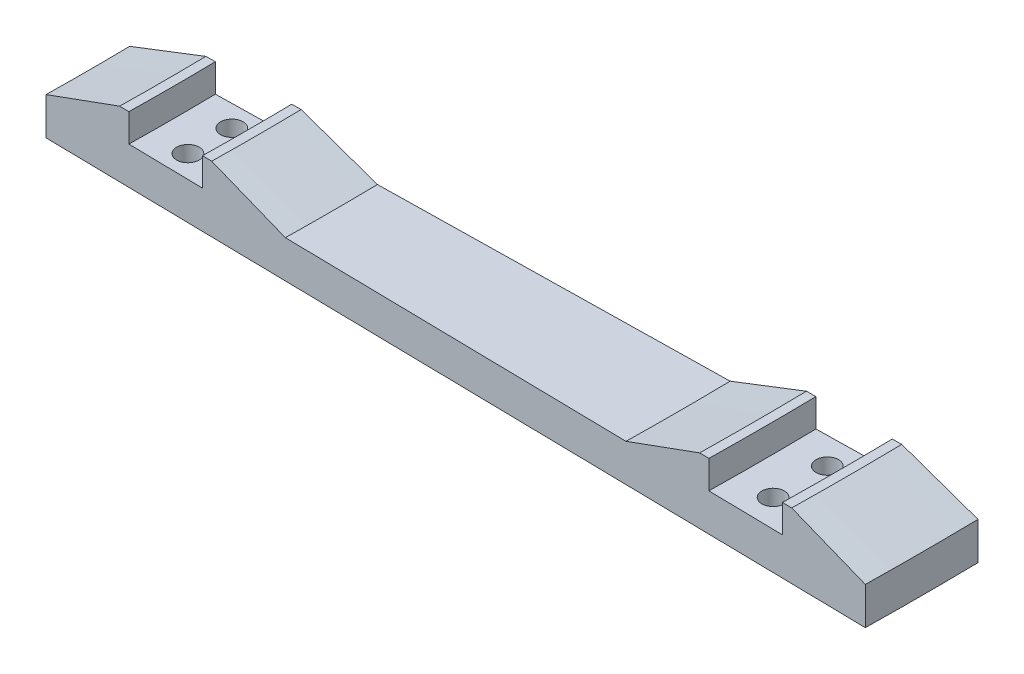
ISO-10303-21;
HEADER;
FILE_DESCRIPTION(('STEP AP214'),'2;1');
FILE_NAME('part.step','',(''),(''),'','','');
FILE_SCHEMA(('AUTOMOTIVE_DESIGN { 1 0 10303 214 1 1 1 1 }'));
ENDSEC;
DATA;
#1=APPLICATION_CONTEXT('core data for automotive mechanical design processes');
#2=APPLICATION_PROTOCOL_DEFINITION('international standard','automotive_design',2000,#1);
#3=PRODUCT_CONTEXT('',#1,'mechanical');
#4=PRODUCT('Part','Part','',(#3));
#5=PRODUCT_RELATED_PRODUCT_CATEGORY('part','',(#4));
#6=PRODUCT_DEFINITION_FORMATION('','',#4);
#7=PRODUCT_DEFINITION_CONTEXT('part definition',#1,'design');
#8=PRODUCT_DEFINITION('design','',#6,#7);
#9=PRODUCT_DEFINITION_SHAPE('','',#8);
#10=(LENGTH_UNIT() NAMED_UNIT(*) SI_UNIT(.MILLI.,.METRE.));
#11=(NAMED_UNIT(*) PLANE_ANGLE_UNIT() SI_UNIT($,.RADIAN.));
#12=(NAMED_UNIT(*) SI_UNIT($,.STERADIAN.) SOLID_ANGLE_UNIT());
#13=UNCERTAINTY_MEASURE_WITH_UNIT(LENGTH_MEASURE(1.E-05),#10,'distance_accuracy_value','');
#14=(GEOMETRIC_REPRESENTATION_CONTEXT(3) GLOBAL_UNCERTAINTY_ASSIGNED_CONTEXT((#13)) GLOBAL_UNIT_ASSIGNED_CONTEXT((#10,
#11,#12)) REPRESENTATION_CONTEXT('',''));
#15=CARTESIAN_POINT('',(0.,0.,0.));
#16=DIRECTION('',(0.,0.,1.));
#17=DIRECTION('',(1.,0.,0.));
#18=AXIS2_PLACEMENT_3D('',#15,#16,#17);
#19=CARTESIAN_POINT('',(33.4936887478864,-3.50000000000021,3.94642325885546));
#20=DIRECTION('',(0.,1.,0.));
#21=DIRECTION('',(-1.,0.,0.));
#22=AXIS2_PLACEMENT_3D('',#19,#20,#21);
#23=CYLINDRICAL_SURFACE('',#22,0.600000000000001);
#24=CARTESIAN_POINT('',(33.4936887478864,-1.50000000000005,3.94642325885546));
#25=DIRECTION('',(0.,1.,0.));
#26=DIRECTION('',(-1.,0.,0.));
#27=AXIS2_PLACEMENT_3D('',#24,#25,#26);
#28=CIRCLE('',#27,0.600000000000001);
#29=CARTESIAN_POINT('',(32.8936887478864,-1.50000000000005,3.94642325885546));
#30=VERTEX_POINT('',#29);
#31=EDGE_CURVE('E255',#30,#30,#28,.T.);
#32=ORIENTED_EDGE('',*,*,#31,.T.);
#33=EDGE_LOOP('',(#32));
#34=FACE_BOUND('',#33,.T.);
#35=CARTESIAN_POINT('',(33.4936887478864,-2.49999999999999,3.94642325885546));
#36=DIRECTION('',(0.,-1.,0.));
#37=DIRECTION('',(1.,0.,0.));
#38=AXIS2_PLACEMENT_3D('',#35,#36,#37);
#39=CIRCLE('',#38,0.600000000000001);
#40=CARTESIAN_POINT('',(34.0936887478864,-2.49999999999999,3.94642325885546));
#41=VERTEX_POINT('',#40);
#42=EDGE_CURVE('E44',#41,#41,#39,.F.);
#43=ORIENTED_EDGE('',*,*,#42,.F.);
#44=EDGE_LOOP('',(#43));
#45=FACE_BOUND('',#44,.T.);
#46=ADVANCED_FACE('F40',(#34,#45),#23,.F.);
#47=CARTESIAN_POINT('',(1.99488817136499,-3.5000000000001,3.67153739065677));
#48=DIRECTION('',(0.,1.,0.));
#49=DIRECTION('',(-1.,0.,0.));
#50=AXIS2_PLACEMENT_3D('',#47,#48,#49);
#51=CYLINDRICAL_SURFACE('',#50,0.6);
#52=CARTESIAN_POINT('',(1.994888171365,-1.49999999999994,3.67153739065677));
#53=DIRECTION('',(0.,1.,0.));
#54=DIRECTION('',(-1.,0.,0.));
#55=AXIS2_PLACEMENT_3D('',#52,#53,#54);
#56=CIRCLE('',#55,0.6);
#57=CARTESIAN_POINT('',(1.394888171365,-1.49999999999994,3.67153739065677));
#58=VERTEX_POINT('',#57);
#59=EDGE_CURVE('E259',#58,#58,#56,.T.);
#60=ORIENTED_EDGE('',*,*,#59,.T.);
#61=EDGE_LOOP('',(#60));
#62=FACE_BOUND('',#61,.T.);
#63=CARTESIAN_POINT('',(1.99488817136499,-2.5,3.67153739065677));
#64=DIRECTION('',(0.,-1.,0.));
#65=DIRECTION('',(1.,0.,0.));
#66=AXIS2_PLACEMENT_3D('',#63,#64,#65);
#67=CIRCLE('',#66,0.6);
#68=CARTESIAN_POINT('',(2.59488817136499,-2.5,3.67153739065677));
#69=VERTEX_POINT('',#68);
#70=EDGE_CURVE('E246',#69,#69,#67,.F.);
#71=ORIENTED_EDGE('',*,*,#70,.F.);
#72=EDGE_LOOP('',(#71));
#73=FACE_BOUND('',#72,.T.);
#74=ADVANCED_FACE('F350',(#62,#73),#51,.F.);
#75=CARTESIAN_POINT('',(0.,0.,2.5));
#76=DIRECTION('',(0.,-1.,0.));
#77=DIRECTION('',(1.,0.,0.));
#78=AXIS2_PLACEMENT_3D('',#75,#76,#77);
#79=PLANE('',#78);
#80=CARTESIAN_POINT('',(-132.25,0.,2.5));
#81=DIRECTION('',(0.,1.,0.));
#82=DIRECTION('',(0.,0.,1.));
#83=AXIS2_PLACEMENT_3D('',#80,#81,#82);
#84=CIRCLE('',#83,132.25);
#85=CARTESIAN_POINT('',(-0.0201423155672546,0.,4.80808075133075));
#86=VERTEX_POINT('',#85);
#87=CARTESIAN_POINT('',(-0.0201423155672546,0.,0.191919248669251));
#88=VERTEX_POINT('',#87);
#89=EDGE_CURVE('E11',#86,#88,#84,.T.);
#90=ORIENTED_EDGE('',*,*,#89,.T.);
#91=DIRECTION('',(-0.999847695156391,0.,0.0174524064372835));
#92=VECTOR('',#91,1.);
#93=CARTESIAN_POINT('',(-0.0201423155672546,0.,0.191919248669251));
#94=LINE('',#93,#92);
#95=CARTESIAN_POINT('',(-0.52006616314545,0.,0.200645451887892));
#96=VERTEX_POINT('',#95);
#97=EDGE_CURVE('E170',#88,#96,#94,.T.);
#98=ORIENTED_EDGE('',*,*,#97,.T.);
#99=CARTESIAN_POINT('',(-132.25,0.,2.5));
#100=DIRECTION('',(0.,1.,0.));
#101=DIRECTION('',(0.,0.,1.));
#102=AXIS2_PLACEMENT_3D('',#99,#100,#101);
#103=CIRCLE('',#102,131.75);
#104=CARTESIAN_POINT('',(-0.52006616314545,0.,4.79935454811211));
#105=VERTEX_POINT('',#104);
#106=EDGE_CURVE('E49',#105,#96,#103,.T.);
#107=ORIENTED_EDGE('',*,*,#106,.F.);
#108=DIRECTION('',(-0.999847695156391,0.,-0.0174524064372835));
#109=VECTOR('',#108,1.);
#110=CARTESIAN_POINT('',(-0.0201423155672546,0.,4.80808075133075));
#111=LINE('',#110,#109);
#112=EDGE_CURVE('E172',#86,#105,#111,.T.);
#113=ORIENTED_EDGE('',*,*,#112,.F.);
#114=EDGE_LOOP('',(#90,#98,#107,#113));
#115=FACE_BOUND('',#114,.T.);
#116=ADVANCED_FACE('F42',(#115),#79,.F.);
#117=CARTESIAN_POINT('',(0.,-3.5,2.5));
#118=DIRECTION('',(0.,-1.,0.));
#119=DIRECTION('',(1.,0.,0.));
#120=AXIS2_PLACEMENT_3D('',#117,#118,#119);
#121=PLANE('',#120);
#122=CARTESIAN_POINT('',(-132.25,-3.5,2.5));
#123=DIRECTION('',(0.,1.,0.));
#124=DIRECTION('',(0.,0.,1.));
#125=AXIS2_PLACEMENT_3D('',#122,#123,#124);
#126=CIRCLE('',#125,127.75);
#127=CARTESIAN_POINT('',(-4.51945694377102,-3.5,4.72954492236297));
#128=VERTEX_POINT('',#127);
#129=CARTESIAN_POINT('',(-4.51945694377102,-3.5,0.270455077637027));
#130=VERTEX_POINT('',#129);
#131=EDGE_CURVE('E337',#128,#130,#126,.T.);
#132=ORIENTED_EDGE('',*,*,#131,.T.);
#133=DIRECTION('',(0.999847695156391,0.,-0.0174524064372835));
#134=VECTOR('',#133,1.);
#135=CARTESIAN_POINT('',(-4.51945694377102,-3.5,0.270455077637027));
#136=LINE('',#135,#134);
#137=CARTESIAN_POINT('',(39.9737654906884,-3.50000000000008,-0.506177008822091));
#138=VERTEX_POINT('',#137);
#139=EDGE_CURVE('E194',#130,#138,#136,.T.);
#140=ORIENTED_EDGE('',*,*,#139,.T.);
#141=CARTESIAN_POINT('',(-132.25,-3.50000000000007,2.5));
#142=DIRECTION('',(0.,1.,0.));
#143=DIRECTION('',(0.,0.,1.));
#144=AXIS2_PLACEMENT_3D('',#141,#142,#143);
#145=CIRCLE('',#144,172.25);
#146=CARTESIAN_POINT('',(39.9737654906884,-3.50000000000008,5.50617700882209));
#147=VERTEX_POINT('',#146);
#148=EDGE_CURVE('E335',#147,#138,#145,.T.);
#149=ORIENTED_EDGE('',*,*,#148,.F.);
#150=DIRECTION('',(0.999847695156391,0.,0.0174524064372835));
#151=VECTOR('',#150,1.);
#152=CARTESIAN_POINT('',(-4.51945694377102,-3.5,4.72954492236297));
#153=LINE('',#152,#151);
#154=EDGE_CURVE('E270',#128,#147,#153,.T.);
#155=ORIENTED_EDGE('',*,*,#154,.F.);
#156=EDGE_LOOP('',(#132,#140,#149,#155));
#157=FACE_BOUND('',#156,.T.);
#158=CARTESIAN_POINT('',(33.4936887478864,-3.49999999999999,3.94642325885546));
#159=DIRECTION('',(0.,-1.,0.));
#160=DIRECTION('',(1.,0.,0.));
#161=AXIS2_PLACEMENT_3D('',#158,#159,#160);
#162=CIRCLE('',#161,0.999999999999998);
#163=CARTESIAN_POINT('',(34.4936887478864,-3.49999999999999,3.94642325885546));
#164=VERTEX_POINT('',#163);
#165=EDGE_CURVE('E247',#164,#164,#162,.T.);
#166=ORIENTED_EDGE('',*,*,#165,.F.);
#167=EDGE_LOOP('',(#166));
#168=FACE_BOUND('',#167,.T.);
#169=CARTESIAN_POINT('',(1.99488817136499,-3.5,3.67153739065677));
#170=DIRECTION('',(0.,-1.,0.));
#171=DIRECTION('',(1.,0.,0.));
#172=AXIS2_PLACEMENT_3D('',#169,#170,#171);
#173=CIRCLE('',#172,1.);
#174=CARTESIAN_POINT('',(2.99488817136499,-3.5,3.67153739065677));
#175=VERTEX_POINT('',#174);
#176=EDGE_CURVE('E250',#175,#175,#173,.T.);
#177=ORIENTED_EDGE('',*,*,#176,.F.);
#178=EDGE_LOOP('',(#177));
#179=FACE_BOUND('',#178,.T.);
#180=CARTESIAN_POINT('',(33.4936887478864,-3.49999999999999,1.05357674114454));
#181=DIRECTION('',(0.,1.,0.));
#182=DIRECTION('',(1.,0.,0.));
#183=AXIS2_PLACEMENT_3D('',#180,#181,#182);
#184=CIRCLE('',#183,0.999999999999998);
#185=CARTESIAN_POINT('',(34.4936887478864,-3.49999999999999,1.05357674114454));
#186=VERTEX_POINT('',#185);
#187=EDGE_CURVE('E440',#186,#186,#184,.T.);
#188=ORIENTED_EDGE('',*,*,#187,.T.);
#189=EDGE_LOOP('',(#188));
#190=FACE_BOUND('',#189,.T.);
#191=CARTESIAN_POINT('',(1.99488817136499,-3.5,1.32846260934323));
#192=DIRECTION('',(0.,1.,0.));
#193=DIRECTION('',(1.,0.,0.));
#194=AXIS2_PLACEMENT_3D('',#191,#192,#193);
#195=CIRCLE('',#194,1.);
#196=CARTESIAN_POINT('',(2.99488817136499,-3.5,1.32846260934323));
#197=VERTEX_POINT('',#196);
#198=EDGE_CURVE('E443',#197,#197,#195,.T.);
#199=ORIENTED_EDGE('',*,*,#198,.T.);
#200=EDGE_LOOP('',(#199));
#201=FACE_BOUND('',#200,.T.);
#202=ADVANCED_FACE('F424',(#157,#168,#179,#190,#201),#121,.T.);
#203=CARTESIAN_POINT('',(0.,-1.5,2.5));
#204=DIRECTION('',(0.,1.,0.));
#205=DIRECTION('',(0.,0.,1.));
#206=AXIS2_PLACEMENT_3D('',#203,#204,#205);
#207=PLANE('',#206);
#208=CARTESIAN_POINT('',(-132.25,-1.50000000000003,2.5));
#209=DIRECTION('',(0.,1.,0.));
#210=DIRECTION('',(0.,0.,1.));
#211=AXIS2_PLACEMENT_3D('',#208,#209,#210);
#212=CIRCLE('',#211,159.25);
#213=CARTESIAN_POINT('',(26.9757454536553,-1.50000000000003,5.2792957251374));
#214=VERTEX_POINT('',#213);
#215=CARTESIAN_POINT('',(26.9757454536553,-1.50000000000003,-0.279295725137405));
#216=VERTEX_POINT('',#215);
#217=EDGE_CURVE('E319',#214,#216,#212,.T.);
#218=ORIENTED_EDGE('',*,*,#217,.T.);
#219=DIRECTION('',(-0.999847695156391,0.,0.0174524064372835));
#220=VECTOR('',#219,1.);
#221=CARTESIAN_POINT('',(26.9757454536553,-1.50000000000003,-0.279295725137405));
#222=LINE('',#221,#220);
#223=CARTESIAN_POINT('',(8.47856309326207,-1.5,0.0435737939523404));
#224=VERTEX_POINT('',#223);
#225=EDGE_CURVE('E221',#216,#224,#222,.T.);
#226=ORIENTED_EDGE('',*,*,#225,.T.);
#227=CARTESIAN_POINT('',(-132.25,-1.5,2.5));
#228=DIRECTION('',(0.,1.,0.));
#229=DIRECTION('',(0.,0.,1.));
#230=AXIS2_PLACEMENT_3D('',#227,#228,#229);
#231=CIRCLE('',#230,140.75);
#232=CARTESIAN_POINT('',(8.47856309326207,-1.5,4.95642620604766));
#233=VERTEX_POINT('',#232);
#234=EDGE_CURVE('E317',#233,#224,#231,.T.);
#235=ORIENTED_EDGE('',*,*,#234,.F.);
#236=DIRECTION('',(-0.999847695156391,0.,-0.0174524064372835));
#237=VECTOR('',#236,1.);
#238=CARTESIAN_POINT('',(26.9757454536553,-1.50000000000003,5.2792957251374));
#239=LINE('',#238,#237);
#240=EDGE_CURVE('E297',#214,#233,#239,.T.);
#241=ORIENTED_EDGE('',*,*,#240,.F.);
#242=EDGE_LOOP('',(#218,#226,#235,#241));
#243=FACE_BOUND('',#242,.T.);
#244=ADVANCED_FACE('F421',(#243),#207,.T.);
#245=CARTESIAN_POINT('',(0.,0.,2.5));
#246=DIRECTION('',(0.,1.,0.));
#247=DIRECTION('',(0.,0.,1.));
#248=AXIS2_PLACEMENT_3D('',#245,#246,#247);
#249=PLANE('',#248);
#250=CARTESIAN_POINT('',(-132.25,0.,2.5));
#251=DIRECTION('',(0.,1.,0.));
#252=DIRECTION('',(0.,0.,1.));
#253=AXIS2_PLACEMENT_3D('',#250,#251,#252);
#254=CIRCLE('',#253,136.75);
#255=CARTESIAN_POINT('',(4.47917231263651,0.,4.88661658029853));
#256=VERTEX_POINT('',#255);
#257=CARTESIAN_POINT('',(4.47917231263651,0.,0.113383419701474));
#258=VERTEX_POINT('',#257);
#259=EDGE_CURVE('E315',#256,#258,#254,.T.);
#260=ORIENTED_EDGE('',*,*,#259,.T.);
#261=DIRECTION('',(-0.999847695156391,0.,0.0174524064372835));
#262=VECTOR('',#261,1.);
#263=CARTESIAN_POINT('',(4.47917231263651,0.,0.113383419701474));
#264=LINE('',#263,#262);
#265=CARTESIAN_POINT('',(3.97924846505831,0.,0.122109622920116));
#266=VERTEX_POINT('',#265);
#267=EDGE_CURVE('E227',#258,#266,#264,.T.);
#268=ORIENTED_EDGE('',*,*,#267,.T.);
#269=CARTESIAN_POINT('',(-132.25,0.,2.5));
#270=DIRECTION('',(0.,1.,0.));
#271=DIRECTION('',(0.,0.,1.));
#272=AXIS2_PLACEMENT_3D('',#269,#270,#271);
#273=CIRCLE('',#272,136.25);
#274=CARTESIAN_POINT('',(3.97924846505831,0.,4.87789037707988));
#275=VERTEX_POINT('',#274);
#276=EDGE_CURVE('E313',#275,#266,#273,.T.);
#277=ORIENTED_EDGE('',*,*,#276,.F.);
#278=DIRECTION('',(-0.999847695156391,0.,-0.0174524064372835));
#279=VECTOR('',#278,1.);
#280=CARTESIAN_POINT('',(4.47917231263651,0.,4.88661658029853));
#281=LINE('',#280,#279);
#282=EDGE_CURVE('E303',#256,#275,#281,.T.);
#283=ORIENTED_EDGE('',*,*,#282,.F.);
#284=EDGE_LOOP('',(#260,#268,#277,#283));
#285=FACE_BOUND('',#284,.T.);
#286=ADVANCED_FACE('F418',(#285),#249,.T.);
#287=CARTESIAN_POINT('',(0.,-1.5,2.5));
#288=DIRECTION('',(0.,1.,0.));
#289=DIRECTION('',(0.,0.,1.));
#290=AXIS2_PLACEMENT_3D('',#287,#288,#289);
#291=PLANE('',#290);
#292=CARTESIAN_POINT('',(-132.25,-1.5,2.5));
#293=DIRECTION('',(0.,1.,0.));
#294=DIRECTION('',(0.,0.,1.));
#295=AXIS2_PLACEMENT_3D('',#292,#293,#294);
#296=CIRCLE('',#295,136.25);
#297=CARTESIAN_POINT('',(3.97924846505831,-1.5,4.87789037707988));
#298=VERTEX_POINT('',#297);
#299=CARTESIAN_POINT('',(3.97924846505831,-1.5,0.122109622920116));
#300=VERTEX_POINT('',#299);
#301=EDGE_CURVE('E65',#298,#300,#296,.T.);
#302=ORIENTED_EDGE('',*,*,#301,.T.);
#303=DIRECTION('',(-0.999847695156391,0.,0.0174524064372835));
#304=VECTOR('',#303,1.);
#305=CARTESIAN_POINT('',(3.97924846505831,-1.5,0.122109622920116));
#306=LINE('',#305,#304);
#307=CARTESIAN_POINT('',(-0.0201423155672545,-1.5,0.191919248669251));
#308=VERTEX_POINT('',#307);
#309=EDGE_CURVE('E232',#300,#308,#306,.T.);
#310=ORIENTED_EDGE('',*,*,#309,.T.);
#311=CARTESIAN_POINT('',(-132.25,-1.5,2.5));
#312=DIRECTION('',(0.,1.,0.));
#313=DIRECTION('',(0.,0.,1.));
#314=AXIS2_PLACEMENT_3D('',#311,#312,#313);
#315=CIRCLE('',#314,132.25);
#316=CARTESIAN_POINT('',(-0.0201423155672545,-1.5,4.80808075133075));
#317=VERTEX_POINT('',#316);
#318=EDGE_CURVE('E57',#317,#308,#315,.T.);
#319=ORIENTED_EDGE('',*,*,#318,.F.);
#320=DIRECTION('',(-0.999847695156391,0.,-0.0174524064372835));
#321=VECTOR('',#320,1.);
#322=CARTESIAN_POINT('',(3.97924846505831,-1.5,4.87789037707988));
#323=LINE('',#322,#321);
#324=EDGE_CURVE('E308',#298,#317,#323,.T.);
#325=ORIENTED_EDGE('',*,*,#324,.F.);
#326=EDGE_LOOP('',(#302,#310,#319,#325));
#327=FACE_BOUND('',#326,.T.);
#328=ORIENTED_EDGE('',*,*,#59,.F.);
#329=EDGE_LOOP('',(#328));
#330=FACE_BOUND('',#329,.T.);
#331=CARTESIAN_POINT('',(1.994888171365,-1.49999999999994,1.32846260934323));
#332=DIRECTION('',(0.,-1.,0.));
#333=DIRECTION('',(-1.,0.,0.));
#334=AXIS2_PLACEMENT_3D('',#331,#332,#333);
#335=CIRCLE('',#334,0.6);
#336=CARTESIAN_POINT('',(1.394888171365,-1.49999999999994,1.32846260934323));
#337=VERTEX_POINT('',#336);
#338=EDGE_CURVE('E242',#337,#337,#335,.T.);
#339=ORIENTED_EDGE('',*,*,#338,.T.);
#340=EDGE_LOOP('',(#339));
#341=FACE_BOUND('',#340,.T.);
#342=ADVANCED_FACE('F414',(#327,#330,#341),#291,.T.);
#343=CARTESIAN_POINT('',(35.5,0.,2.5));
#344=DIRECTION('',(0.,-1.,0.));
#345=DIRECTION('',(-1.,0.,0.));
#346=AXIS2_PLACEMENT_3D('',#343,#344,#345);
#347=PLANE('',#346);
#348=CARTESIAN_POINT('',(-132.25,0.,2.5));
#349=DIRECTION('',(0.,1.,0.));
#350=DIRECTION('',(0.,0.,1.));
#351=AXIS2_PLACEMENT_3D('',#348,#349,#350);
#352=CIRCLE('',#351,168.25);
#353=CARTESIAN_POINT('',(35.9743747100628,0.,5.43636738307296));
#354=VERTEX_POINT('',#353);
#355=CARTESIAN_POINT('',(35.9743747100628,0.,-0.436367383072958));
#356=VERTEX_POINT('',#355);
#357=EDGE_CURVE('E331',#354,#356,#352,.T.);
#358=ORIENTED_EDGE('',*,*,#357,.T.);
#359=DIRECTION('',(-0.999847695156391,0.,0.0174524064372835));
#360=VECTOR('',#359,1.);
#361=CARTESIAN_POINT('',(35.9743747100628,0.,-0.436367383072958));
#362=LINE('',#361,#360);
#363=CARTESIAN_POINT('',(35.4744508624846,0.,-0.427641179854316));
#364=VERTEX_POINT('',#363);
#365=EDGE_CURVE('E203',#356,#364,#362,.T.);
#366=ORIENTED_EDGE('',*,*,#365,.T.);
#367=CARTESIAN_POINT('',(-132.25,0.,2.5));
#368=DIRECTION('',(0.,1.,0.));
#369=DIRECTION('',(0.,0.,1.));
#370=AXIS2_PLACEMENT_3D('',#367,#368,#369);
#371=CIRCLE('',#370,167.75);
#372=CARTESIAN_POINT('',(35.4744508624846,0.,5.42764117985432));
#373=VERTEX_POINT('',#372);
#374=EDGE_CURVE('E329',#373,#364,#371,.T.);
#375=ORIENTED_EDGE('',*,*,#374,.F.);
#376=DIRECTION('',(-0.999847695156391,0.,-0.0174524064372835));
#377=VECTOR('',#376,1.);
#378=CARTESIAN_POINT('',(35.9743747100628,0.,5.43636738307296));
#379=LINE('',#378,#377);
#380=EDGE_CURVE('E279',#354,#373,#379,.T.);
#381=ORIENTED_EDGE('',*,*,#380,.F.);
#382=EDGE_LOOP('',(#358,#366,#375,#381));
#383=FACE_BOUND('',#382,.T.);
#384=ADVANCED_FACE('F410',(#383),#347,.F.);
#385=CARTESIAN_POINT('',(35.5,0.,2.5));
#386=DIRECTION('',(0.,1.,0.));
#387=DIRECTION('',(0.,0.,1.));
#388=AXIS2_PLACEMENT_3D('',#385,#386,#387);
#389=PLANE('',#388);
#390=CARTESIAN_POINT('',(-132.25,0.,2.5));
#391=DIRECTION('',(0.,1.,0.));
#392=DIRECTION('',(0.,0.,1.));
#393=AXIS2_PLACEMENT_3D('',#390,#391,#392);
#394=CIRCLE('',#393,163.75);
#395=CARTESIAN_POINT('',(31.4750600818591,0.,5.35783155410518));
#396=VERTEX_POINT('',#395);
#397=CARTESIAN_POINT('',(31.4750600818591,0.,-0.357831554105181));
#398=VERTEX_POINT('',#397);
#399=EDGE_CURVE('E323',#396,#398,#394,.T.);
#400=ORIENTED_EDGE('',*,*,#399,.T.);
#401=DIRECTION('',(-0.999847695156391,0.,0.0174524064372835));
#402=VECTOR('',#401,1.);
#403=CARTESIAN_POINT('',(31.4750600818591,0.,-0.357831554105181));
#404=LINE('',#403,#402);
#405=CARTESIAN_POINT('',(30.9751362342809,0.,-0.34910535088654));
#406=VERTEX_POINT('',#405);
#407=EDGE_CURVE('E215',#398,#406,#404,.T.);
#408=ORIENTED_EDGE('',*,*,#407,.T.);
#409=CARTESIAN_POINT('',(-132.25,0.,2.5));
#410=DIRECTION('',(0.,1.,0.));
#411=DIRECTION('',(0.,0.,1.));
#412=AXIS2_PLACEMENT_3D('',#409,#410,#411);
#413=CIRCLE('',#412,163.25);
#414=CARTESIAN_POINT('',(30.9751362342809,0.,5.34910535088654));
#415=VERTEX_POINT('',#414);
#416=EDGE_CURVE('E321',#415,#406,#413,.T.);
#417=ORIENTED_EDGE('',*,*,#416,.F.);
#418=DIRECTION('',(-0.999847695156391,0.,-0.0174524064372835));
#419=VECTOR('',#418,1.);
#420=CARTESIAN_POINT('',(31.4750600818591,0.,5.35783155410518));
#421=LINE('',#420,#419);
#422=EDGE_CURVE('E291',#396,#415,#421,.T.);
#423=ORIENTED_EDGE('',*,*,#422,.F.);
#424=EDGE_LOOP('',(#400,#408,#417,#423));
#425=FACE_BOUND('',#424,.T.);
#426=ADVANCED_FACE('F406',(#425),#389,.T.);
#427=CARTESIAN_POINT('',(35.5,-1.50000000000006,2.5));
#428=DIRECTION('',(0.,1.,0.));
#429=DIRECTION('',(0.,0.,1.));
#430=AXIS2_PLACEMENT_3D('',#427,#428,#429);
#431=PLANE('',#430);
#432=CARTESIAN_POINT('',(-132.25,-1.50000000000006,2.5));
#433=DIRECTION('',(0.,1.,0.));
#434=DIRECTION('',(0.,0.,1.));
#435=AXIS2_PLACEMENT_3D('',#432,#433,#434);
#436=CIRCLE('',#435,167.75);
#437=CARTESIAN_POINT('',(35.4744508624846,-1.50000000000006,5.42764117985432));
#438=VERTEX_POINT('',#437);
#439=CARTESIAN_POINT('',(35.4744508624846,-1.50000000000006,-0.427641179854316));
#440=VERTEX_POINT('',#439);
#441=EDGE_CURVE('E327',#438,#440,#436,.T.);
#442=ORIENTED_EDGE('',*,*,#441,.T.);
#443=DIRECTION('',(-0.999847695156391,0.,0.0174524064372835));
#444=VECTOR('',#443,1.);
#445=CARTESIAN_POINT('',(35.4744508624846,-1.50000000000006,-0.427641179854316));
#446=LINE('',#445,#444);
#447=CARTESIAN_POINT('',(31.4750600818591,-1.50000000000005,-0.357831554105181));
#448=VERTEX_POINT('',#447);
#449=EDGE_CURVE('E209',#440,#448,#446,.T.);
#450=ORIENTED_EDGE('',*,*,#449,.T.);
#451=CARTESIAN_POINT('',(-132.25,-1.50000000000004,2.5));
#452=DIRECTION('',(0.,1.,0.));
#453=DIRECTION('',(0.,0.,1.));
#454=AXIS2_PLACEMENT_3D('',#451,#452,#453);
#455=CIRCLE('',#454,163.75);
#456=CARTESIAN_POINT('',(31.4750600818591,-1.50000000000005,5.35783155410518));
#457=VERTEX_POINT('',#456);
#458=EDGE_CURVE('E325',#457,#448,#455,.T.);
#459=ORIENTED_EDGE('',*,*,#458,.F.);
#460=DIRECTION('',(-0.999847695156391,0.,-0.0174524064372835));
#461=VECTOR('',#460,1.);
#462=CARTESIAN_POINT('',(35.4744508624846,-1.50000000000006,5.42764117985432));
#463=LINE('',#462,#461);
#464=EDGE_CURVE('E285',#438,#457,#463,.T.);
#465=ORIENTED_EDGE('',*,*,#464,.F.);
#466=EDGE_LOOP('',(#442,#450,#459,#465));
#467=FACE_BOUND('',#466,.T.);
#468=ORIENTED_EDGE('',*,*,#31,.F.);
#469=EDGE_LOOP('',(#468));
#470=FACE_BOUND('',#469,.T.);
#471=CARTESIAN_POINT('',(33.4936887478864,-1.50000000000005,1.05357674114454));
#472=DIRECTION('',(0.,-1.,0.));
#473=DIRECTION('',(-1.,0.,0.));
#474=AXIS2_PLACEMENT_3D('',#471,#472,#473);
#475=CIRCLE('',#474,0.600000000000001);
#476=CARTESIAN_POINT('',(32.8936887478864,-1.50000000000005,1.05357674114454));
#477=VERTEX_POINT('',#476);
#478=EDGE_CURVE('E180',#477,#477,#475,.T.);
#479=ORIENTED_EDGE('',*,*,#478,.T.);
#480=EDGE_LOOP('',(#479));
#481=FACE_BOUND('',#480,.T.);
#482=ADVANCED_FACE('F370',(#467,#470,#481),#431,.T.);
#483=CARTESIAN_POINT('',(-132.25,94.85357759964,2.5));
#484=DIRECTION('',(0.,1.,0.));
#485=DIRECTION('',(0.,0.,1.));
#486=AXIS2_PLACEMENT_3D('',#483,#484,#485);
#487=CYLINDRICAL_SURFACE('',#486,132.25);
#488=ORIENTED_EDGE('',*,*,#89,.F.);
#489=DIRECTION('',(0.,1.,0.));
#490=VECTOR('',#489,1.);
#491=CARTESIAN_POINT('',(-0.0201423155672545,-1.5,4.80808075133075));
#492=LINE('',#491,#490);
#493=EDGE_CURVE('E258',#317,#86,#492,.T.);
#494=ORIENTED_EDGE('',*,*,#493,.F.);
#495=ORIENTED_EDGE('',*,*,#318,.T.);
#496=DIRECTION('',(0.,1.,0.));
#497=VECTOR('',#496,1.);
#498=CARTESIAN_POINT('',(-0.0201423155672545,-1.5,0.191919248669251));
#499=LINE('',#498,#497);
#500=EDGE_CURVE('E176',#308,#88,#499,.T.);
#501=ORIENTED_EDGE('',*,*,#500,.T.);
#502=EDGE_LOOP('',(#488,#494,#495,#501));
#503=FACE_BOUND('',#502,.T.);
#504=ADVANCED_FACE('F177',(#503),#487,.T.);
#505=CARTESIAN_POINT('',(-132.25,0.,2.5));
#506=DIRECTION('',(0.,1.,0.));
#507=DIRECTION('',(0.,0.,1.));
#508=AXIS2_PLACEMENT_3D('',#505,#506,#507);
#509=CONICAL_SURFACE('',#508,131.75,1.21202565652432);
#510=CARTESIAN_POINT('',(-132.25,-1.5,2.5));
#511=DIRECTION('',(0.,1.,0.));
#512=DIRECTION('',(0.,0.,1.));
#513=AXIS2_PLACEMENT_3D('',#510,#511,#512);
#514=CIRCLE('',#513,127.75);
#515=CARTESIAN_POINT('',(-4.51945694377101,-1.5,4.72954492236297));
#516=VERTEX_POINT('',#515);
#517=CARTESIAN_POINT('',(-4.51945694377101,-1.5,0.270455077637026));
#518=VERTEX_POINT('',#517);
#519=EDGE_CURVE('E339',#516,#518,#514,.T.);
#520=ORIENTED_EDGE('',*,*,#519,.F.);
#521=DIRECTION('',(-0.936186570100088,-0.351123441588392,-0.0163411973660224));
#522=VECTOR('',#521,1.);
#523=CARTESIAN_POINT('',(-0.52006616314545,0.,4.79935454811211));
#524=LINE('',#523,#522);
#525=EDGE_CURVE('E264',#105,#516,#524,.T.);
#526=ORIENTED_EDGE('',*,*,#525,.F.);
#527=ORIENTED_EDGE('',*,*,#106,.T.);
#528=DIRECTION('',(-0.936186570100088,-0.351123441588392,0.0163411973660224));
#529=VECTOR('',#528,1.);
#530=CARTESIAN_POINT('',(-0.52006616314545,0.,0.200645451887892));
#531=LINE('',#530,#529);
#532=EDGE_CURVE('E186',#96,#518,#531,.T.);
#533=ORIENTED_EDGE('',*,*,#532,.T.);
#534=EDGE_LOOP('',(#520,#526,#527,#533));
#535=FACE_BOUND('',#534,.T.);
#536=ADVANCED_FACE('F369',(#535),#509,.F.);
#537=CARTESIAN_POINT('',(-132.25,94.85357759964,2.5));
#538=DIRECTION('',(0.,1.,0.));
#539=DIRECTION('',(0.,0.,1.));
#540=AXIS2_PLACEMENT_3D('',#537,#538,#539);
#541=CYLINDRICAL_SURFACE('',#540,127.75);
#542=ORIENTED_EDGE('',*,*,#131,.F.);
#543=DIRECTION('',(0.,-1.,0.));
#544=VECTOR('',#543,1.);
#545=CARTESIAN_POINT('',(-4.51945694377101,-1.5,4.72954492236297));
#546=LINE('',#545,#544);
#547=EDGE_CURVE('E267',#516,#128,#546,.T.);
#548=ORIENTED_EDGE('',*,*,#547,.F.);
#549=ORIENTED_EDGE('',*,*,#519,.T.);
#550=DIRECTION('',(0.,-1.,0.));
#551=VECTOR('',#550,1.);
#552=CARTESIAN_POINT('',(-4.51945694377101,-1.5,0.270455077637026));
#553=LINE('',#552,#551);
#554=EDGE_CURVE('E188',#518,#130,#553,.T.);
#555=ORIENTED_EDGE('',*,*,#554,.T.);
#556=EDGE_LOOP('',(#542,#548,#549,#555));
#557=FACE_BOUND('',#556,.T.);
#558=ADVANCED_FACE('F396',(#557),#541,.F.);
#559=CARTESIAN_POINT('',(-132.25,94.85357759964,2.5));
#560=DIRECTION('',(0.,1.,0.));
#561=DIRECTION('',(0.,0.,1.));
#562=AXIS2_PLACEMENT_3D('',#559,#560,#561);
#563=CYLINDRICAL_SURFACE('',#562,172.25);
#564=CARTESIAN_POINT('',(-132.25,-1.50000000000008,2.5));
#565=DIRECTION('',(0.,1.,0.));
#566=DIRECTION('',(0.,0.,1.));
#567=AXIS2_PLACEMENT_3D('',#564,#565,#566);
#568=CIRCLE('',#567,172.25);
#569=CARTESIAN_POINT('',(39.9737654906884,-1.50000000000008,5.50617700882209));
#570=VERTEX_POINT('',#569);
#571=CARTESIAN_POINT('',(39.9737654906884,-1.50000000000008,-0.506177008822091));
#572=VERTEX_POINT('',#571);
#573=EDGE_CURVE('E333',#570,#572,#568,.T.);
#574=ORIENTED_EDGE('',*,*,#573,.F.);
#575=DIRECTION('',(0.,1.,0.));
#576=VECTOR('',#575,1.);
#577=CARTESIAN_POINT('',(39.9737654906884,-3.50000000000008,5.50617700882209));
#578=LINE('',#577,#576);
#579=EDGE_CURVE('E273',#147,#570,#578,.T.);
#580=ORIENTED_EDGE('',*,*,#579,.F.);
#581=ORIENTED_EDGE('',*,*,#148,.T.);
#582=DIRECTION('',(0.,1.,0.));
#583=VECTOR('',#582,1.);
#584=CARTESIAN_POINT('',(39.9737654906884,-3.50000000000008,-0.506177008822091));
#585=LINE('',#584,#583);
#586=EDGE_CURVE('E197',#138,#572,#585,.T.);
#587=ORIENTED_EDGE('',*,*,#586,.T.);
#588=EDGE_LOOP('',(#574,#580,#581,#587));
#589=FACE_BOUND('',#588,.T.);
#590=ADVANCED_FACE('F392',(#589),#563,.T.);
#591=CARTESIAN_POINT('',(-132.25,-1.50000000000008,2.5));
#592=DIRECTION('',(0.,-1.,0.));
#593=DIRECTION('',(0.,0.,-1.));
#594=AXIS2_PLACEMENT_3D('',#591,#592,#593);
#595=CONICAL_SURFACE('',#594,172.25,1.21202565652432);
#596=ORIENTED_EDGE('',*,*,#357,.F.);
#597=DIRECTION('',(-0.936186570100087,0.351123441588395,-0.0163411973660224));
#598=VECTOR('',#597,1.);
#599=CARTESIAN_POINT('',(39.9737654906884,-1.50000000000008,5.50617700882209));
#600=LINE('',#599,#598);
#601=EDGE_CURVE('E276',#570,#354,#600,.T.);
#602=ORIENTED_EDGE('',*,*,#601,.F.);
#603=ORIENTED_EDGE('',*,*,#573,.T.);
#604=DIRECTION('',(-0.936186570100087,0.351123441588395,0.0163411973660224));
#605=VECTOR('',#604,1.);
#606=CARTESIAN_POINT('',(39.9737654906884,-1.50000000000008,-0.506177008822091));
#607=LINE('',#606,#605);
#608=EDGE_CURVE('E200',#572,#356,#607,.T.);
#609=ORIENTED_EDGE('',*,*,#608,.T.);
#610=EDGE_LOOP('',(#596,#602,#603,#609));
#611=FACE_BOUND('',#610,.T.);
#612=ADVANCED_FACE('F388',(#611),#595,.T.);
#613=CARTESIAN_POINT('',(-132.25,94.85357759964,2.5));
#614=DIRECTION('',(0.,1.,0.));
#615=DIRECTION('',(0.,0.,1.));
#616=AXIS2_PLACEMENT_3D('',#613,#614,#615);
#617=CYLINDRICAL_SURFACE('',#616,167.75);
#618=ORIENTED_EDGE('',*,*,#441,.F.);
#619=DIRECTION('',(0.,-1.,0.));
#620=VECTOR('',#619,1.);
#621=CARTESIAN_POINT('',(35.4744508624846,0.,5.42764117985432));
#622=LINE('',#621,#620);
#623=EDGE_CURVE('E282',#373,#438,#622,.T.);
#624=ORIENTED_EDGE('',*,*,#623,.F.);
#625=ORIENTED_EDGE('',*,*,#374,.T.);
#626=DIRECTION('',(0.,-1.,0.));
#627=VECTOR('',#626,1.);
#628=CARTESIAN_POINT('',(35.4744508624846,0.,-0.427641179854316));
#629=LINE('',#628,#627);
#630=EDGE_CURVE('E206',#364,#440,#629,.T.);
#631=ORIENTED_EDGE('',*,*,#630,.T.);
#632=EDGE_LOOP('',(#618,#624,#625,#631));
#633=FACE_BOUND('',#632,.T.);
#634=ADVANCED_FACE('F384',(#633),#617,.F.);
#635=CARTESIAN_POINT('',(-132.25,94.85357759964,2.5));
#636=DIRECTION('',(0.,1.,0.));
#637=DIRECTION('',(0.,0.,1.));
#638=AXIS2_PLACEMENT_3D('',#635,#636,#637);
#639=CYLINDRICAL_SURFACE('',#638,163.75);
#640=ORIENTED_EDGE('',*,*,#399,.F.);
#641=DIRECTION('',(0.,1.,0.));
#642=VECTOR('',#641,1.);
#643=CARTESIAN_POINT('',(31.4750600818591,-1.50000000000005,5.35783155410518));
#644=LINE('',#643,#642);
#645=EDGE_CURVE('E288',#457,#396,#644,.T.);
#646=ORIENTED_EDGE('',*,*,#645,.F.);
#647=ORIENTED_EDGE('',*,*,#458,.T.);
#648=DIRECTION('',(0.,1.,0.));
#649=VECTOR('',#648,1.);
#650=CARTESIAN_POINT('',(31.4750600818591,-1.50000000000005,-0.357831554105181));
#651=LINE('',#650,#649);
#652=EDGE_CURVE('E212',#448,#398,#651,.T.);
#653=ORIENTED_EDGE('',*,*,#652,.T.);
#654=EDGE_LOOP('',(#640,#646,#647,#653));
#655=FACE_BOUND('',#654,.T.);
#656=ADVANCED_FACE('F380',(#655),#639,.T.);
#657=CARTESIAN_POINT('',(-132.25,0.,2.5));
#658=DIRECTION('',(0.,1.,0.));
#659=DIRECTION('',(0.,0.,1.));
#660=AXIS2_PLACEMENT_3D('',#657,#658,#659);
#661=CONICAL_SURFACE('',#660,163.25,1.21202565652433);
#662=ORIENTED_EDGE('',*,*,#217,.F.);
#663=DIRECTION('',(-0.93618657010009,-0.351123441588388,-0.0163411973660224));
#664=VECTOR('',#663,1.);
#665=CARTESIAN_POINT('',(30.9751362342809,0.,5.34910535088654));
#666=LINE('',#665,#664);
#667=EDGE_CURVE('E294',#415,#214,#666,.T.);
#668=ORIENTED_EDGE('',*,*,#667,.F.);
#669=ORIENTED_EDGE('',*,*,#416,.T.);
#670=DIRECTION('',(-0.93618657010009,-0.351123441588388,0.0163411973660224));
#671=VECTOR('',#670,1.);
#672=CARTESIAN_POINT('',(30.9751362342809,0.,-0.34910535088654));
#673=LINE('',#672,#671);
#674=EDGE_CURVE('E218',#406,#216,#673,.T.);
#675=ORIENTED_EDGE('',*,*,#674,.T.);
#676=EDGE_LOOP('',(#662,#668,#669,#675));
#677=FACE_BOUND('',#676,.T.);
#678=ADVANCED_FACE('F376',(#677),#661,.F.);
#679=CARTESIAN_POINT('',(-132.25,-1.5,2.5));
#680=DIRECTION('',(0.,-1.,0.));
#681=DIRECTION('',(0.,0.,-1.));
#682=AXIS2_PLACEMENT_3D('',#679,#680,#681);
#683=CONICAL_SURFACE('',#682,140.75,1.21202565652432);
#684=ORIENTED_EDGE('',*,*,#259,.F.);
#685=DIRECTION('',(-0.936186570100089,0.351123441588392,-0.0163411973660224));
#686=VECTOR('',#685,1.);
#687=CARTESIAN_POINT('',(8.47856309326207,-1.5,4.95642620604766));
#688=LINE('',#687,#686);
#689=EDGE_CURVE('E300',#233,#256,#688,.T.);
#690=ORIENTED_EDGE('',*,*,#689,.F.);
#691=ORIENTED_EDGE('',*,*,#234,.T.);
#692=DIRECTION('',(-0.936186570100089,0.351123441588392,0.0163411973660224));
#693=VECTOR('',#692,1.);
#694=CARTESIAN_POINT('',(8.47856309326207,-1.5,0.0435737939523404));
#695=LINE('',#694,#693);
#696=EDGE_CURVE('E224',#224,#258,#695,.T.);
#697=ORIENTED_EDGE('',*,*,#696,.T.);
#698=EDGE_LOOP('',(#684,#690,#691,#697));
#699=FACE_BOUND('',#698,.T.);
#700=ADVANCED_FACE('F373',(#699),#683,.T.);
#701=CARTESIAN_POINT('',(-132.25,94.85357759964,2.5));
#702=DIRECTION('',(0.,1.,0.));
#703=DIRECTION('',(0.,0.,1.));
#704=AXIS2_PLACEMENT_3D('',#701,#702,#703);
#705=CYLINDRICAL_SURFACE('',#704,136.25);
#706=ORIENTED_EDGE('',*,*,#301,.F.);
#707=DIRECTION('',(0.,-1.,0.));
#708=VECTOR('',#707,1.);
#709=CARTESIAN_POINT('',(3.97924846505831,0.,4.87789037707988));
#710=LINE('',#709,#708);
#711=EDGE_CURVE('E306',#275,#298,#710,.T.);
#712=ORIENTED_EDGE('',*,*,#711,.F.);
#713=ORIENTED_EDGE('',*,*,#276,.T.);
#714=DIRECTION('',(0.,-1.,0.));
#715=VECTOR('',#714,1.);
#716=CARTESIAN_POINT('',(3.97924846505831,0.,0.122109622920116));
#717=LINE('',#716,#715);
#718=EDGE_CURVE('E230',#266,#300,#717,.T.);
#719=ORIENTED_EDGE('',*,*,#718,.T.);
#720=EDGE_LOOP('',(#706,#712,#713,#719));
#721=FACE_BOUND('',#720,.T.);
#722=ADVANCED_FACE('F365',(#721),#705,.F.);
#723=CARTESIAN_POINT('',(-0.0201423155672546,0.,4.80808075133075));
#724=DIRECTION('',(-0.0174524064372835,0.,0.999847695156391));
#725=DIRECTION('',(0.999847695156391,0.,0.0174524064372835));
#726=AXIS2_PLACEMENT_3D('',#723,#724,#725);
#727=PLANE('',#726);
#728=ORIENTED_EDGE('',*,*,#493,.T.);
#729=ORIENTED_EDGE('',*,*,#112,.T.);
#730=ORIENTED_EDGE('',*,*,#525,.T.);
#731=ORIENTED_EDGE('',*,*,#547,.T.);
#732=ORIENTED_EDGE('',*,*,#154,.T.);
#733=ORIENTED_EDGE('',*,*,#579,.T.);
#734=ORIENTED_EDGE('',*,*,#601,.T.);
#735=ORIENTED_EDGE('',*,*,#380,.T.);
#736=ORIENTED_EDGE('',*,*,#623,.T.);
#737=ORIENTED_EDGE('',*,*,#464,.T.);
#738=ORIENTED_EDGE('',*,*,#645,.T.);
#739=ORIENTED_EDGE('',*,*,#422,.T.);
#740=ORIENTED_EDGE('',*,*,#667,.T.);
#741=ORIENTED_EDGE('',*,*,#240,.T.);
#742=ORIENTED_EDGE('',*,*,#689,.T.);
#743=ORIENTED_EDGE('',*,*,#282,.T.);
#744=ORIENTED_EDGE('',*,*,#711,.T.);
#745=ORIENTED_EDGE('',*,*,#324,.T.);
#746=EDGE_LOOP('',(#728,#729,#730,#731,#732,#733,#734,#735,#736,#737,#738,#739,#740,#741,#742,
#743,#744,#745));
#747=FACE_BOUND('',#746,.T.);
#748=ADVANCED_FACE('F362',(#747),#727,.T.);
#749=CARTESIAN_POINT('',(1.99488817136499,-2.5,3.67153739065677));
#750=DIRECTION('',(0.,-1.,0.));
#751=DIRECTION('',(1.,0.,0.));
#752=AXIS2_PLACEMENT_3D('',#749,#750,#751);
#753=PLANE('',#752);
#754=CARTESIAN_POINT('',(1.99488817136499,-2.5,3.67153739065677));
#755=DIRECTION('',(0.,-1.,0.));
#756=DIRECTION('',(1.,0.,0.));
#757=AXIS2_PLACEMENT_3D('',#754,#755,#756);
#758=CIRCLE('',#757,1.);
#759=CARTESIAN_POINT('',(2.99488817136499,-2.5,3.67153739065677));
#760=VERTEX_POINT('',#759);
#761=EDGE_CURVE('E234',#760,#760,#758,.T.);
#762=ORIENTED_EDGE('',*,*,#761,.T.);
#763=EDGE_LOOP('',(#762));
#764=FACE_BOUND('',#763,.T.);
#765=ORIENTED_EDGE('',*,*,#70,.T.);
#766=EDGE_LOOP('',(#765));
#767=FACE_BOUND('',#766,.T.);
#768=ADVANCED_FACE('F359',(#764,#767),#753,.T.);
#769=CARTESIAN_POINT('',(1.99488817136499,-2.5,3.67153739065677));
#770=DIRECTION('',(0.,-1.,0.));
#771=DIRECTION('',(1.,0.,0.));
#772=AXIS2_PLACEMENT_3D('',#769,#770,#771);
#773=CYLINDRICAL_SURFACE('',#772,1.);
#774=ORIENTED_EDGE('',*,*,#761,.F.);
#775=EDGE_LOOP('',(#774));
#776=FACE_BOUND('',#775,.T.);
#777=ORIENTED_EDGE('',*,*,#176,.T.);
#778=EDGE_LOOP('',(#777));
#779=FACE_BOUND('',#778,.T.);
#780=ADVANCED_FACE('F486',(#776,#779),#773,.F.);
#781=CARTESIAN_POINT('',(33.4936887478864,-2.49999999999999,3.94642325885546));
#782=DIRECTION('',(0.,-1.,0.));
#783=DIRECTION('',(1.,0.,0.));
#784=AXIS2_PLACEMENT_3D('',#781,#782,#783);
#785=PLANE('',#784);
#786=CARTESIAN_POINT('',(33.4936887478864,-2.49999999999999,3.94642325885546));
#787=DIRECTION('',(0.,-1.,0.));
#788=DIRECTION('',(1.,0.,0.));
#789=AXIS2_PLACEMENT_3D('',#786,#787,#788);
#790=CIRCLE('',#789,0.999999999999998);
#791=CARTESIAN_POINT('',(34.4936887478864,-2.49999999999999,3.94642325885546));
#792=VERTEX_POINT('',#791);
#793=EDGE_CURVE('E243',#792,#792,#790,.T.);
#794=ORIENTED_EDGE('',*,*,#793,.T.);
#795=EDGE_LOOP('',(#794));
#796=FACE_BOUND('',#795,.T.);
#797=ORIENTED_EDGE('',*,*,#42,.T.);
#798=EDGE_LOOP('',(#797));
#799=FACE_BOUND('',#798,.T.);
#800=ADVANCED_FACE('F347',(#796,#799),#785,.T.);
#801=CARTESIAN_POINT('',(33.4936887478864,-2.49999999999999,3.94642325885546));
#802=DIRECTION('',(0.,-1.,0.));
#803=DIRECTION('',(1.,0.,0.));
#804=AXIS2_PLACEMENT_3D('',#801,#802,#803);
#805=CYLINDRICAL_SURFACE('',#804,0.999999999999998);
#806=ORIENTED_EDGE('',*,*,#793,.F.);
#807=EDGE_LOOP('',(#806));
#808=FACE_BOUND('',#807,.T.);
#809=ORIENTED_EDGE('',*,*,#165,.T.);
#810=EDGE_LOOP('',(#809));
#811=FACE_BOUND('',#810,.T.);
#812=ADVANCED_FACE('F481',(#808,#811),#805,.F.);
#813=CARTESIAN_POINT('',(33.4936887478864,-3.50000000000021,1.05357674114454));
#814=DIRECTION('',(0.,1.,0.));
#815=DIRECTION('',(-1.,0.,0.));
#816=AXIS2_PLACEMENT_3D('',#813,#814,#815);
#817=CYLINDRICAL_SURFACE('',#816,0.600000000000001);
#818=ORIENTED_EDGE('',*,*,#478,.F.);
#819=EDGE_LOOP('',(#818));
#820=FACE_BOUND('',#819,.T.);
#821=CARTESIAN_POINT('',(33.4936887478864,-2.49999999999999,1.05357674114454));
#822=DIRECTION('',(0.,1.,0.));
#823=DIRECTION('',(1.,0.,0.));
#824=AXIS2_PLACEMENT_3D('',#821,#822,#823);
#825=CIRCLE('',#824,0.600000000000001);
#826=CARTESIAN_POINT('',(34.0936887478864,-2.49999999999999,1.05357674114454));
#827=VERTEX_POINT('',#826);
#828=EDGE_CURVE('E238',#827,#827,#825,.F.);
#829=ORIENTED_EDGE('',*,*,#828,.T.);
#830=EDGE_LOOP('',(#829));
#831=FACE_BOUND('',#830,.T.);
#832=ADVANCED_FACE('F460',(#820,#831),#817,.F.);
#833=CARTESIAN_POINT('',(1.99488817136499,-3.5000000000001,1.32846260934323));
#834=DIRECTION('',(0.,1.,0.));
#835=DIRECTION('',(-1.,0.,0.));
#836=AXIS2_PLACEMENT_3D('',#833,#834,#835);
#837=CYLINDRICAL_SURFACE('',#836,0.6);
#838=ORIENTED_EDGE('',*,*,#338,.F.);
#839=EDGE_LOOP('',(#838));
#840=FACE_BOUND('',#839,.T.);
#841=CARTESIAN_POINT('',(1.99488817136499,-2.5,1.32846260934323));
#842=DIRECTION('',(0.,1.,0.));
#843=DIRECTION('',(1.,0.,0.));
#844=AXIS2_PLACEMENT_3D('',#841,#842,#843);
#845=CIRCLE('',#844,0.6);
#846=CARTESIAN_POINT('',(2.59488817136499,-2.5,1.32846260934323));
#847=VERTEX_POINT('',#846);
#848=EDGE_CURVE('E235',#847,#847,#845,.F.);
#849=ORIENTED_EDGE('',*,*,#848,.T.);
#850=EDGE_LOOP('',(#849));
#851=FACE_BOUND('',#850,.T.);
#852=ADVANCED_FACE('F457',(#840,#851),#837,.F.);
#853=CARTESIAN_POINT('',(-0.0201423155672546,0.,0.191919248669251));
#854=DIRECTION('',(-0.0174524064372835,0.,-0.999847695156391));
#855=DIRECTION('',(0.999847695156391,0.,-0.0174524064372835));
#856=AXIS2_PLACEMENT_3D('',#853,#854,#855);
#857=PLANE('',#856);
#858=ORIENTED_EDGE('',*,*,#500,.F.);
#859=ORIENTED_EDGE('',*,*,#309,.F.);
#860=ORIENTED_EDGE('',*,*,#718,.F.);
#861=ORIENTED_EDGE('',*,*,#267,.F.);
#862=ORIENTED_EDGE('',*,*,#696,.F.);
#863=ORIENTED_EDGE('',*,*,#225,.F.);
#864=ORIENTED_EDGE('',*,*,#674,.F.);
#865=ORIENTED_EDGE('',*,*,#407,.F.);
#866=ORIENTED_EDGE('',*,*,#652,.F.);
#867=ORIENTED_EDGE('',*,*,#449,.F.);
#868=ORIENTED_EDGE('',*,*,#630,.F.);
#869=ORIENTED_EDGE('',*,*,#365,.F.);
#870=ORIENTED_EDGE('',*,*,#608,.F.);
#871=ORIENTED_EDGE('',*,*,#586,.F.);
#872=ORIENTED_EDGE('',*,*,#139,.F.);
#873=ORIENTED_EDGE('',*,*,#554,.F.);
#874=ORIENTED_EDGE('',*,*,#532,.F.);
#875=ORIENTED_EDGE('',*,*,#97,.F.);
#876=EDGE_LOOP('',(#858,#859,#860,#861,#862,#863,#864,#865,#866,#867,#868,#869,#870,#871,#872,
#873,#874,#875));
#877=FACE_BOUND('',#876,.T.);
#878=ADVANCED_FACE('F183',(#877),#857,.T.);
#879=CARTESIAN_POINT('',(1.99488817136499,-2.5,1.32846260934323));
#880=DIRECTION('',(0.,-1.,0.));
#881=DIRECTION('',(1.,0.,0.));
#882=AXIS2_PLACEMENT_3D('',#879,#880,#881);
#883=PLANE('',#882);
#884=CARTESIAN_POINT('',(1.99488817136499,-2.5,1.32846260934323));
#885=DIRECTION('',(0.,1.,0.));
#886=DIRECTION('',(1.,0.,0.));
#887=AXIS2_PLACEMENT_3D('',#884,#885,#886);
#888=CIRCLE('',#887,1.);
#889=CARTESIAN_POINT('',(2.99488817136499,-2.5,1.32846260934323));
#890=VERTEX_POINT('',#889);
#891=EDGE_CURVE('E445',#890,#890,#888,.T.);
#892=ORIENTED_EDGE('',*,*,#891,.F.);
#893=EDGE_LOOP('',(#892));
#894=FACE_BOUND('',#893,.T.);
#895=ORIENTED_EDGE('',*,*,#848,.F.);
#896=EDGE_LOOP('',(#895));
#897=FACE_BOUND('',#896,.T.);
#898=ADVANCED_FACE('F464',(#894,#897),#883,.T.);
#899=CARTESIAN_POINT('',(1.99488817136499,-2.5,1.32846260934323));
#900=DIRECTION('',(0.,-1.,0.));
#901=DIRECTION('',(1.,0.,0.));
#902=AXIS2_PLACEMENT_3D('',#899,#900,#901);
#903=CYLINDRICAL_SURFACE('',#902,1.);
#904=ORIENTED_EDGE('',*,*,#891,.T.);
#905=EDGE_LOOP('',(#904));
#906=FACE_BOUND('',#905,.T.);
#907=ORIENTED_EDGE('',*,*,#198,.F.);
#908=EDGE_LOOP('',(#907));
#909=FACE_BOUND('',#908,.T.);
#910=ADVANCED_FACE('F466',(#906,#909),#903,.F.);
#911=CARTESIAN_POINT('',(33.4936887478864,-2.49999999999999,1.05357674114454));
#912=DIRECTION('',(0.,-1.,0.));
#913=DIRECTION('',(1.,0.,0.));
#914=AXIS2_PLACEMENT_3D('',#911,#912,#913);
#915=PLANE('',#914);
#916=CARTESIAN_POINT('',(33.4936887478864,-2.49999999999999,1.05357674114454));
#917=DIRECTION('',(0.,1.,0.));
#918=DIRECTION('',(1.,0.,0.));
#919=AXIS2_PLACEMENT_3D('',#916,#917,#918);
#920=CIRCLE('',#919,0.999999999999998);
#921=CARTESIAN_POINT('',(34.4936887478864,-2.49999999999999,1.05357674114454));
#922=VERTEX_POINT('',#921);
#923=EDGE_CURVE('E239',#922,#922,#920,.T.);
#924=ORIENTED_EDGE('',*,*,#923,.F.);
#925=EDGE_LOOP('',(#924));
#926=FACE_BOUND('',#925,.T.);
#927=ORIENTED_EDGE('',*,*,#828,.F.);
#928=EDGE_LOOP('',(#927));
#929=FACE_BOUND('',#928,.T.);
#930=ADVANCED_FACE('F473',(#926,#929),#915,.T.);
#931=CARTESIAN_POINT('',(33.4936887478864,-2.49999999999999,1.05357674114454));
#932=DIRECTION('',(0.,-1.,0.));
#933=DIRECTION('',(1.,0.,0.));
#934=AXIS2_PLACEMENT_3D('',#931,#932,#933);
#935=CYLINDRICAL_SURFACE('',#934,0.999999999999998);
#936=ORIENTED_EDGE('',*,*,#923,.T.);
#937=EDGE_LOOP('',(#936));
#938=FACE_BOUND('',#937,.T.);
#939=ORIENTED_EDGE('',*,*,#187,.F.);
#940=EDGE_LOOP('',(#939));
#941=FACE_BOUND('',#940,.T.);
#942=ADVANCED_FACE('F710',(#938,#941),#935,.F.);
#943=CLOSED_SHELL('',(#46,#74,#116,#202,#244,#286,#342,#384,#426,#482,#504,#536,#558,#590,#612,
#634,#656,#678,#700,#722,#748,#768,#780,#800,#812,#832,#852,#878,#898,#910,#930,#942));
#944=MANIFOLD_SOLID_BREP('B2',#943);
#945=ADVANCED_BREP_SHAPE_REPRESENTATION('',(#18,#944),#14);
#946=SHAPE_DEFINITION_REPRESENTATION(#9,#945);
ENDSEC;
END-ISO-10303-21;
